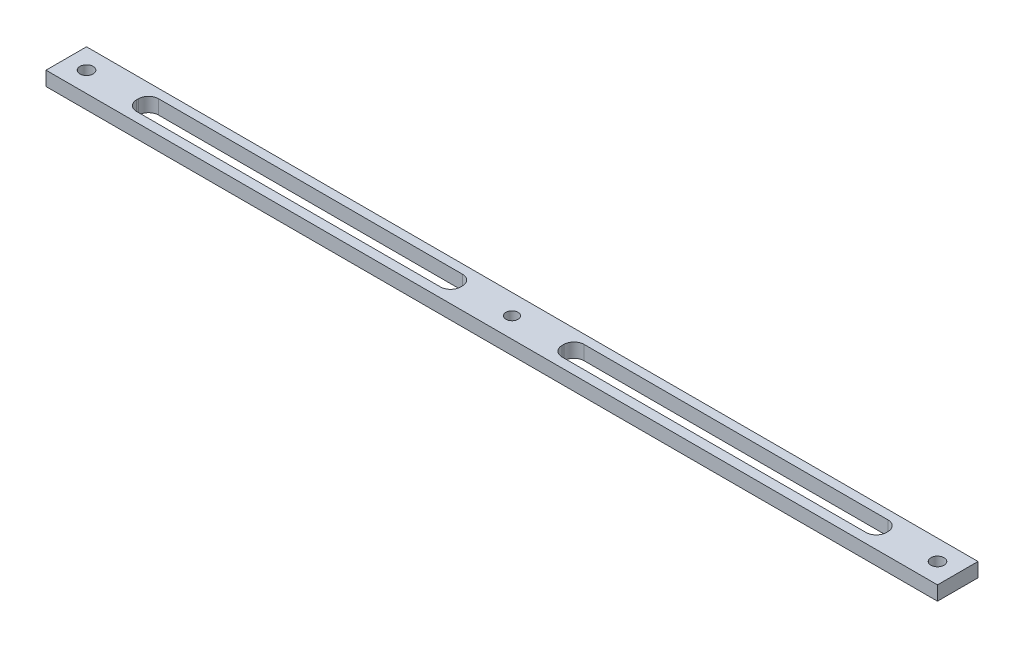
ISO-10303-21;
HEADER;
FILE_DESCRIPTION(('STEP AP214'),'2;1');
FILE_NAME('part.step','',(''),(''),'','','');
FILE_SCHEMA(('AUTOMOTIVE_DESIGN { 1 0 10303 214 1 1 1 1 }'));
ENDSEC;
DATA;
#1=APPLICATION_CONTEXT('core data for automotive mechanical design processes');
#2=APPLICATION_PROTOCOL_DEFINITION('international standard','automotive_design',2000,#1);
#3=PRODUCT_CONTEXT('',#1,'mechanical');
#4=PRODUCT('Part','Part','',(#3));
#5=PRODUCT_RELATED_PRODUCT_CATEGORY('part','',(#4));
#6=PRODUCT_DEFINITION_FORMATION('','',#4);
#7=PRODUCT_DEFINITION_CONTEXT('part definition',#1,'design');
#8=PRODUCT_DEFINITION('design','',#6,#7);
#9=PRODUCT_DEFINITION_SHAPE('','',#8);
#10=(LENGTH_UNIT() NAMED_UNIT(*) SI_UNIT(.MILLI.,.METRE.));
#11=(NAMED_UNIT(*) PLANE_ANGLE_UNIT() SI_UNIT($,.RADIAN.));
#12=(NAMED_UNIT(*) SI_UNIT($,.STERADIAN.) SOLID_ANGLE_UNIT());
#13=UNCERTAINTY_MEASURE_WITH_UNIT(LENGTH_MEASURE(1.E-05),#10,'distance_accuracy_value','');
#14=(GEOMETRIC_REPRESENTATION_CONTEXT(3) GLOBAL_UNCERTAINTY_ASSIGNED_CONTEXT((#13)) GLOBAL_UNIT_ASSIGNED_CONTEXT((#10,
#11,#12)) REPRESENTATION_CONTEXT('',''));
#15=CARTESIAN_POINT('',(0.,0.,0.));
#16=DIRECTION('',(0.,0.,1.));
#17=DIRECTION('',(1.,0.,0.));
#18=AXIS2_PLACEMENT_3D('',#15,#16,#17);
#19=CARTESIAN_POINT('',(0.,7.,0.));
#20=DIRECTION('',(0.,0.,-1.));
#21=DIRECTION('',(-1.,0.,0.));
#22=AXIS2_PLACEMENT_3D('',#19,#20,#21);
#23=PLANE('',#22);
#24=DIRECTION('',(1.,0.,0.));
#25=VECTOR('',#24,1.);
#26=CARTESIAN_POINT('',(0.,0.,0.));
#27=LINE('',#26,#25);
#28=CARTESIAN_POINT('',(0.,0.,0.));
#29=VERTEX_POINT('',#28);
#30=CARTESIAN_POINT('',(440.,0.,-1.07552855510562E-13));
#31=VERTEX_POINT('',#30);
#32=EDGE_CURVE('E296',#29,#31,#27,.T.);
#33=ORIENTED_EDGE('',*,*,#32,.T.);
#34=DIRECTION('',(0.,-1.,0.));
#35=VECTOR('',#34,1.);
#36=CARTESIAN_POINT('',(440.,7.,-1.07552855510562E-13));
#37=LINE('',#36,#35);
#38=CARTESIAN_POINT('',(440.,7.,-1.07552855510562E-13));
#39=VERTEX_POINT('',#38);
#40=EDGE_CURVE('E11',#39,#31,#37,.T.);
#41=ORIENTED_EDGE('',*,*,#40,.F.);
#42=DIRECTION('',(1.,0.,0.));
#43=VECTOR('',#42,1.);
#44=CARTESIAN_POINT('',(0.,7.,0.));
#45=LINE('',#44,#43);
#46=CARTESIAN_POINT('',(0.,7.,0.));
#47=VERTEX_POINT('',#46);
#48=EDGE_CURVE('E199',#47,#39,#45,.T.);
#49=ORIENTED_EDGE('',*,*,#48,.F.);
#50=DIRECTION('',(0.,-1.,0.));
#51=VECTOR('',#50,1.);
#52=CARTESIAN_POINT('',(0.,7.,0.));
#53=LINE('',#52,#51);
#54=EDGE_CURVE('E67',#47,#29,#53,.T.);
#55=ORIENTED_EDGE('',*,*,#54,.T.);
#56=EDGE_LOOP('',(#33,#41,#49,#55));
#57=FACE_BOUND('',#56,.T.);
#58=ADVANCED_FACE('F47',(#57),#23,.F.);
#59=CARTESIAN_POINT('',(440.,7.,0.));
#60=DIRECTION('',(-1.,0.,0.));
#61=DIRECTION('',(0.,0.,1.));
#62=AXIS2_PLACEMENT_3D('',#59,#60,#61);
#63=PLANE('',#62);
#64=DIRECTION('',(0.,0.,-1.));
#65=VECTOR('',#64,1.);
#66=CARTESIAN_POINT('',(440.,0.,0.));
#67=LINE('',#66,#65);
#68=CARTESIAN_POINT('',(440.,0.,-20.));
#69=VERTEX_POINT('',#68);
#70=EDGE_CURVE('E206',#31,#69,#67,.T.);
#71=ORIENTED_EDGE('',*,*,#70,.T.);
#72=DIRECTION('',(0.,-1.,0.));
#73=VECTOR('',#72,1.);
#74=CARTESIAN_POINT('',(440.,7.,-20.));
#75=LINE('',#74,#73);
#76=CARTESIAN_POINT('',(440.,7.,-20.));
#77=VERTEX_POINT('',#76);
#78=EDGE_CURVE('E58',#77,#69,#75,.T.);
#79=ORIENTED_EDGE('',*,*,#78,.F.);
#80=DIRECTION('',(0.,0.,-1.));
#81=VECTOR('',#80,1.);
#82=CARTESIAN_POINT('',(440.,7.,0.));
#83=LINE('',#82,#81);
#84=EDGE_CURVE('E193',#39,#77,#83,.T.);
#85=ORIENTED_EDGE('',*,*,#84,.F.);
#86=ORIENTED_EDGE('',*,*,#40,.T.);
#87=EDGE_LOOP('',(#71,#79,#85,#86));
#88=FACE_BOUND('',#87,.T.);
#89=ADVANCED_FACE('F205',(#88),#63,.F.);
#90=CARTESIAN_POINT('',(0.,7.,-20.));
#91=DIRECTION('',(0.,0.,-1.));
#92=DIRECTION('',(-1.,0.,0.));
#93=AXIS2_PLACEMENT_3D('',#90,#91,#92);
#94=PLANE('',#93);
#95=DIRECTION('',(1.,0.,0.));
#96=VECTOR('',#95,1.);
#97=CARTESIAN_POINT('',(0.,0.,-20.));
#98=LINE('',#97,#96);
#99=CARTESIAN_POINT('',(0.,0.,-20.));
#100=VERTEX_POINT('',#99);
#101=EDGE_CURVE('E301',#100,#69,#98,.T.);
#102=ORIENTED_EDGE('',*,*,#101,.F.);
#103=DIRECTION('',(0.,-1.,0.));
#104=VECTOR('',#103,1.);
#105=CARTESIAN_POINT('',(0.,7.,-20.));
#106=LINE('',#105,#104);
#107=CARTESIAN_POINT('',(0.,7.,-20.));
#108=VERTEX_POINT('',#107);
#109=EDGE_CURVE('E129',#108,#100,#106,.T.);
#110=ORIENTED_EDGE('',*,*,#109,.F.);
#111=DIRECTION('',(1.,0.,0.));
#112=VECTOR('',#111,1.);
#113=CARTESIAN_POINT('',(0.,7.,-20.));
#114=LINE('',#113,#112);
#115=EDGE_CURVE('E198',#108,#77,#114,.T.);
#116=ORIENTED_EDGE('',*,*,#115,.T.);
#117=ORIENTED_EDGE('',*,*,#78,.T.);
#118=EDGE_LOOP('',(#102,#110,#116,#117));
#119=FACE_BOUND('',#118,.T.);
#120=ADVANCED_FACE('F211',(#119),#94,.T.);
#121=CARTESIAN_POINT('',(250.,7.,-10.574576279988));
#122=DIRECTION('',(0.,-1.,0.));
#123=DIRECTION('',(0.,0.,-1.));
#124=AXIS2_PLACEMENT_3D('',#121,#122,#123);
#125=CYLINDRICAL_SURFACE('',#124,5.);
#126=CARTESIAN_POINT('',(250.,0.,-10.574576279988));
#127=DIRECTION('',(0.,1.,0.));
#128=DIRECTION('',(0.,0.,1.));
#129=AXIS2_PLACEMENT_3D('',#126,#127,#128);
#130=CIRCLE('',#129,5.);
#131=CARTESIAN_POINT('',(250.,0.,-15.574576279988));
#132=VERTEX_POINT('',#131);
#133=CARTESIAN_POINT('',(245.,0.,-10.574576279988));
#134=VERTEX_POINT('',#133);
#135=EDGE_CURVE('E264',#132,#134,#130,.T.);
#136=ORIENTED_EDGE('',*,*,#135,.F.);
#137=DIRECTION('',(0.,-1.,0.));
#138=VECTOR('',#137,1.);
#139=CARTESIAN_POINT('',(250.,7.,-15.574576279988));
#140=LINE('',#139,#138);
#141=CARTESIAN_POINT('',(250.,7.,-15.574576279988));
#142=VERTEX_POINT('',#141);
#143=EDGE_CURVE('E311',#142,#132,#140,.T.);
#144=ORIENTED_EDGE('',*,*,#143,.F.);
#145=CARTESIAN_POINT('',(250.,7.,-10.574576279988));
#146=DIRECTION('',(0.,1.,0.));
#147=DIRECTION('',(0.,0.,1.));
#148=AXIS2_PLACEMENT_3D('',#145,#146,#147);
#149=CIRCLE('',#148,5.);
#150=CARTESIAN_POINT('',(245.,7.,-10.574576279988));
#151=VERTEX_POINT('',#150);
#152=EDGE_CURVE('E421',#142,#151,#149,.T.);
#153=ORIENTED_EDGE('',*,*,#152,.T.);
#154=DIRECTION('',(0.,-1.,0.));
#155=VECTOR('',#154,1.);
#156=CARTESIAN_POINT('',(245.,7.,-10.574576279988));
#157=LINE('',#156,#155);
#158=EDGE_CURVE('E314',#151,#134,#157,.T.);
#159=ORIENTED_EDGE('',*,*,#158,.T.);
#160=EDGE_LOOP('',(#136,#144,#153,#159));
#161=FACE_BOUND('',#160,.T.);
#162=ADVANCED_FACE('F467',(#161),#125,.F.);
#163=CARTESIAN_POINT('',(0.,7.,-15.574576279988));
#164=DIRECTION('',(0.,0.,-1.));
#165=DIRECTION('',(-1.,0.,0.));
#166=AXIS2_PLACEMENT_3D('',#163,#164,#165);
#167=PLANE('',#166);
#168=DIRECTION('',(1.,0.,0.));
#169=VECTOR('',#168,1.);
#170=CARTESIAN_POINT('',(0.,0.,-15.574576279988));
#171=LINE('',#170,#169);
#172=CARTESIAN_POINT('',(400.,0.,-15.574576279988));
#173=VERTEX_POINT('',#172);
#174=EDGE_CURVE('E268',#132,#173,#171,.T.);
#175=ORIENTED_EDGE('',*,*,#174,.T.);
#176=DIRECTION('',(0.,-1.,0.));
#177=VECTOR('',#176,1.);
#178=CARTESIAN_POINT('',(400.,7.,-15.574576279988));
#179=LINE('',#178,#177);
#180=CARTESIAN_POINT('',(400.,7.,-15.574576279988));
#181=VERTEX_POINT('',#180);
#182=EDGE_CURVE('E332',#181,#173,#179,.T.);
#183=ORIENTED_EDGE('',*,*,#182,.F.);
#184=DIRECTION('',(1.,0.,0.));
#185=VECTOR('',#184,1.);
#186=CARTESIAN_POINT('',(0.,7.,-15.574576279988));
#187=LINE('',#186,#185);
#188=EDGE_CURVE('E425',#142,#181,#187,.T.);
#189=ORIENTED_EDGE('',*,*,#188,.F.);
#190=ORIENTED_EDGE('',*,*,#143,.T.);
#191=EDGE_LOOP('',(#175,#183,#189,#190));
#192=FACE_BOUND('',#191,.T.);
#193=ADVANCED_FACE('F471',(#192),#167,.F.);
#194=CARTESIAN_POINT('',(400.,7.,-10.574576279988));
#195=DIRECTION('',(0.,-1.,0.));
#196=DIRECTION('',(0.,0.,-1.));
#197=AXIS2_PLACEMENT_3D('',#194,#195,#196);
#198=CYLINDRICAL_SURFACE('',#197,5.);
#199=CARTESIAN_POINT('',(400.,0.,-10.574576279988));
#200=DIRECTION('',(0.,1.,0.));
#201=DIRECTION('',(0.,0.,1.));
#202=AXIS2_PLACEMENT_3D('',#199,#200,#201);
#203=CIRCLE('',#202,5.);
#204=CARTESIAN_POINT('',(405.,0.,-10.574576279988));
#205=VERTEX_POINT('',#204);
#206=EDGE_CURVE('E272',#205,#173,#203,.T.);
#207=ORIENTED_EDGE('',*,*,#206,.F.);
#208=DIRECTION('',(0.,-1.,0.));
#209=VECTOR('',#208,1.);
#210=CARTESIAN_POINT('',(405.,7.,-10.574576279988));
#211=LINE('',#210,#209);
#212=CARTESIAN_POINT('',(405.,7.,-10.574576279988));
#213=VERTEX_POINT('',#212);
#214=EDGE_CURVE('E329',#213,#205,#211,.T.);
#215=ORIENTED_EDGE('',*,*,#214,.F.);
#216=CARTESIAN_POINT('',(400.,7.,-10.574576279988));
#217=DIRECTION('',(0.,1.,0.));
#218=DIRECTION('',(0.,0.,1.));
#219=AXIS2_PLACEMENT_3D('',#216,#217,#218);
#220=CIRCLE('',#219,5.);
#221=EDGE_CURVE('E428',#213,#181,#220,.T.);
#222=ORIENTED_EDGE('',*,*,#221,.T.);
#223=ORIENTED_EDGE('',*,*,#182,.T.);
#224=EDGE_LOOP('',(#207,#215,#222,#223));
#225=FACE_BOUND('',#224,.T.);
#226=ADVANCED_FACE('F477',(#225),#198,.F.);
#227=CARTESIAN_POINT('',(405.,7.,0.));
#228=DIRECTION('',(1.,0.,0.));
#229=DIRECTION('',(0.,0.,-1.));
#230=AXIS2_PLACEMENT_3D('',#227,#228,#229);
#231=PLANE('',#230);
#232=DIRECTION('',(0.,0.,1.));
#233=VECTOR('',#232,1.);
#234=CARTESIAN_POINT('',(405.,0.,0.));
#235=LINE('',#234,#233);
#236=CARTESIAN_POINT('',(405.,0.,-9.75277634577937));
#237=VERTEX_POINT('',#236);
#238=EDGE_CURVE('E276',#205,#237,#235,.T.);
#239=ORIENTED_EDGE('',*,*,#238,.T.);
#240=DIRECTION('',(0.,-1.,0.));
#241=VECTOR('',#240,1.);
#242=CARTESIAN_POINT('',(405.,7.,-9.75277634577937));
#243=LINE('',#242,#241);
#244=CARTESIAN_POINT('',(405.,7.,-9.75277634577937));
#245=VERTEX_POINT('',#244);
#246=EDGE_CURVE('E326',#245,#237,#243,.T.);
#247=ORIENTED_EDGE('',*,*,#246,.F.);
#248=DIRECTION('',(0.,0.,1.));
#249=VECTOR('',#248,1.);
#250=CARTESIAN_POINT('',(405.,7.,0.));
#251=LINE('',#250,#249);
#252=EDGE_CURVE('E432',#213,#245,#251,.T.);
#253=ORIENTED_EDGE('',*,*,#252,.F.);
#254=ORIENTED_EDGE('',*,*,#214,.T.);
#255=EDGE_LOOP('',(#239,#247,#253,#254));
#256=FACE_BOUND('',#255,.T.);
#257=ADVANCED_FACE('F480',(#256),#231,.F.);
#258=CARTESIAN_POINT('',(400.,7.,-9.75277634577937));
#259=DIRECTION('',(0.,-1.,0.));
#260=DIRECTION('',(0.,0.,-1.));
#261=AXIS2_PLACEMENT_3D('',#258,#259,#260);
#262=CYLINDRICAL_SURFACE('',#261,5.);
#263=CARTESIAN_POINT('',(400.,0.,-9.75277634577937));
#264=DIRECTION('',(0.,1.,0.));
#265=DIRECTION('',(0.,0.,1.));
#266=AXIS2_PLACEMENT_3D('',#263,#264,#265);
#267=CIRCLE('',#266,5.);
#268=CARTESIAN_POINT('',(400.,0.,-4.75277634577937));
#269=VERTEX_POINT('',#268);
#270=EDGE_CURVE('E280',#269,#237,#267,.T.);
#271=ORIENTED_EDGE('',*,*,#270,.F.);
#272=DIRECTION('',(0.,-1.,0.));
#273=VECTOR('',#272,1.);
#274=CARTESIAN_POINT('',(400.,7.,-4.75277634577937));
#275=LINE('',#274,#273);
#276=CARTESIAN_POINT('',(400.,7.,-4.75277634577937));
#277=VERTEX_POINT('',#276);
#278=EDGE_CURVE('E323',#277,#269,#275,.T.);
#279=ORIENTED_EDGE('',*,*,#278,.F.);
#280=CARTESIAN_POINT('',(400.,7.,-9.75277634577937));
#281=DIRECTION('',(0.,1.,0.));
#282=DIRECTION('',(0.,0.,1.));
#283=AXIS2_PLACEMENT_3D('',#280,#281,#282);
#284=CIRCLE('',#283,5.);
#285=EDGE_CURVE('E435',#277,#245,#284,.T.);
#286=ORIENTED_EDGE('',*,*,#285,.T.);
#287=ORIENTED_EDGE('',*,*,#246,.T.);
#288=EDGE_LOOP('',(#271,#279,#286,#287));
#289=FACE_BOUND('',#288,.T.);
#290=ADVANCED_FACE('F483',(#289),#262,.F.);
#291=CARTESIAN_POINT('',(0.,7.,-4.75277634577937));
#292=DIRECTION('',(0.,0.,-1.));
#293=DIRECTION('',(-1.,0.,0.));
#294=AXIS2_PLACEMENT_3D('',#291,#292,#293);
#295=PLANE('',#294);
#296=DIRECTION('',(1.,0.,0.));
#297=VECTOR('',#296,1.);
#298=CARTESIAN_POINT('',(0.,0.,-4.75277634577937));
#299=LINE('',#298,#297);
#300=CARTESIAN_POINT('',(250.,0.,-4.75277634577937));
#301=VERTEX_POINT('',#300);
#302=EDGE_CURVE('E284',#301,#269,#299,.T.);
#303=ORIENTED_EDGE('',*,*,#302,.F.);
#304=DIRECTION('',(0.,-1.,0.));
#305=VECTOR('',#304,1.);
#306=CARTESIAN_POINT('',(250.,7.,-4.75277634577937));
#307=LINE('',#306,#305);
#308=CARTESIAN_POINT('',(250.,7.,-4.75277634577937));
#309=VERTEX_POINT('',#308);
#310=EDGE_CURVE('E320',#309,#301,#307,.T.);
#311=ORIENTED_EDGE('',*,*,#310,.F.);
#312=DIRECTION('',(1.,0.,0.));
#313=VECTOR('',#312,1.);
#314=CARTESIAN_POINT('',(0.,7.,-4.75277634577937));
#315=LINE('',#314,#313);
#316=EDGE_CURVE('E439',#309,#277,#315,.T.);
#317=ORIENTED_EDGE('',*,*,#316,.T.);
#318=ORIENTED_EDGE('',*,*,#278,.T.);
#319=EDGE_LOOP('',(#303,#311,#317,#318));
#320=FACE_BOUND('',#319,.T.);
#321=ADVANCED_FACE('F485',(#320),#295,.T.);
#322=CARTESIAN_POINT('',(250.,7.,-9.75277634577937));
#323=DIRECTION('',(0.,-1.,0.));
#324=DIRECTION('',(0.,0.,-1.));
#325=AXIS2_PLACEMENT_3D('',#322,#323,#324);
#326=CYLINDRICAL_SURFACE('',#325,5.);
#327=CARTESIAN_POINT('',(250.,0.,-9.75277634577937));
#328=DIRECTION('',(0.,1.,0.));
#329=DIRECTION('',(0.,0.,1.));
#330=AXIS2_PLACEMENT_3D('',#327,#328,#329);
#331=CIRCLE('',#330,5.);
#332=CARTESIAN_POINT('',(245.,0.,-9.75277634577937));
#333=VERTEX_POINT('',#332);
#334=EDGE_CURVE('E288',#301,#333,#331,.F.);
#335=ORIENTED_EDGE('',*,*,#334,.T.);
#336=DIRECTION('',(0.,-1.,0.));
#337=VECTOR('',#336,1.);
#338=CARTESIAN_POINT('',(245.,7.,-9.75277634577937));
#339=LINE('',#338,#337);
#340=CARTESIAN_POINT('',(245.,7.,-9.75277634577937));
#341=VERTEX_POINT('',#340);
#342=EDGE_CURVE('E317',#341,#333,#339,.T.);
#343=ORIENTED_EDGE('',*,*,#342,.F.);
#344=CARTESIAN_POINT('',(250.,7.,-9.75277634577937));
#345=DIRECTION('',(0.,1.,0.));
#346=DIRECTION('',(0.,0.,1.));
#347=AXIS2_PLACEMENT_3D('',#344,#345,#346);
#348=CIRCLE('',#347,5.);
#349=EDGE_CURVE('E443',#309,#341,#348,.F.);
#350=ORIENTED_EDGE('',*,*,#349,.F.);
#351=ORIENTED_EDGE('',*,*,#310,.T.);
#352=EDGE_LOOP('',(#335,#343,#350,#351));
#353=FACE_BOUND('',#352,.T.);
#354=ADVANCED_FACE('F460',(#353),#326,.F.);
#355=CARTESIAN_POINT('',(40.,7.,-10.5745762799879));
#356=DIRECTION('',(0.,-1.,0.));
#357=DIRECTION('',(0.,0.,-1.));
#358=AXIS2_PLACEMENT_3D('',#355,#356,#357);
#359=CYLINDRICAL_SURFACE('',#358,4.99999999999999);
#360=CARTESIAN_POINT('',(40.,0.,-10.5745762799879));
#361=DIRECTION('',(0.,1.,0.));
#362=DIRECTION('',(0.,0.,1.));
#363=AXIS2_PLACEMENT_3D('',#360,#361,#362);
#364=CIRCLE('',#363,4.99999999999999);
#365=CARTESIAN_POINT('',(40.,0.,-15.5745762799879));
#366=VERTEX_POINT('',#365);
#367=CARTESIAN_POINT('',(35.,0.,-10.5745762799879));
#368=VERTEX_POINT('',#367);
#369=EDGE_CURVE('E232',#366,#368,#364,.T.);
#370=ORIENTED_EDGE('',*,*,#369,.F.);
#371=DIRECTION('',(0.,-1.,0.));
#372=VECTOR('',#371,1.);
#373=CARTESIAN_POINT('',(40.,7.,-15.5745762799879));
#374=LINE('',#373,#372);
#375=CARTESIAN_POINT('',(40.,7.,-15.5745762799879));
#376=VERTEX_POINT('',#375);
#377=EDGE_CURVE('E51',#376,#366,#374,.T.);
#378=ORIENTED_EDGE('',*,*,#377,.F.);
#379=CARTESIAN_POINT('',(40.,7.,-10.5745762799879));
#380=DIRECTION('',(0.,1.,0.));
#381=DIRECTION('',(0.,0.,1.));
#382=AXIS2_PLACEMENT_3D('',#379,#380,#381);
#383=CIRCLE('',#382,4.99999999999999);
#384=CARTESIAN_POINT('',(35.,7.,-10.5745762799879));
#385=VERTEX_POINT('',#384);
#386=EDGE_CURVE('E371',#376,#385,#383,.T.);
#387=ORIENTED_EDGE('',*,*,#386,.T.);
#388=DIRECTION('',(0.,-1.,0.));
#389=VECTOR('',#388,1.);
#390=CARTESIAN_POINT('',(35.,7.,-10.5745762799879));
#391=LINE('',#390,#389);
#392=EDGE_CURVE('E216',#385,#368,#391,.T.);
#393=ORIENTED_EDGE('',*,*,#392,.T.);
#394=EDGE_LOOP('',(#370,#378,#387,#393));
#395=FACE_BOUND('',#394,.T.);
#396=ADVANCED_FACE('F370',(#395),#359,.F.);
#397=CARTESIAN_POINT('',(0.,7.,-15.5745762799879));
#398=DIRECTION('',(0.,0.,-1.));
#399=DIRECTION('',(-1.,0.,0.));
#400=AXIS2_PLACEMENT_3D('',#397,#398,#399);
#401=PLANE('',#400);
#402=DIRECTION('',(1.,0.,0.));
#403=VECTOR('',#402,1.);
#404=CARTESIAN_POINT('',(0.,0.,-15.5745762799879));
#405=LINE('',#404,#403);
#406=CARTESIAN_POINT('',(190.,0.,-15.5745762799879));
#407=VERTEX_POINT('',#406);
#408=EDGE_CURVE('E236',#366,#407,#405,.T.);
#409=ORIENTED_EDGE('',*,*,#408,.T.);
#410=DIRECTION('',(0.,-1.,0.));
#411=VECTOR('',#410,1.);
#412=CARTESIAN_POINT('',(190.,7.,-15.5745762799879));
#413=LINE('',#412,#411);
#414=CARTESIAN_POINT('',(190.,7.,-15.5745762799879));
#415=VERTEX_POINT('',#414);
#416=EDGE_CURVE('E353',#415,#407,#413,.T.);
#417=ORIENTED_EDGE('',*,*,#416,.F.);
#418=DIRECTION('',(1.,0.,0.));
#419=VECTOR('',#418,1.);
#420=CARTESIAN_POINT('',(0.,7.,-15.5745762799879));
#421=LINE('',#420,#419);
#422=EDGE_CURVE('E363',#376,#415,#421,.T.);
#423=ORIENTED_EDGE('',*,*,#422,.F.);
#424=ORIENTED_EDGE('',*,*,#377,.T.);
#425=EDGE_LOOP('',(#409,#417,#423,#424));
#426=FACE_BOUND('',#425,.T.);
#427=ADVANCED_FACE('F362',(#426),#401,.F.);
#428=CARTESIAN_POINT('',(190.,7.,-10.5745762799879));
#429=DIRECTION('',(0.,-1.,0.));
#430=DIRECTION('',(0.,0.,-1.));
#431=AXIS2_PLACEMENT_3D('',#428,#429,#430);
#432=CYLINDRICAL_SURFACE('',#431,5.);
#433=CARTESIAN_POINT('',(190.,0.,-10.5745762799879));
#434=DIRECTION('',(0.,1.,0.));
#435=DIRECTION('',(0.,0.,1.));
#436=AXIS2_PLACEMENT_3D('',#433,#434,#435);
#437=CIRCLE('',#436,5.);
#438=CARTESIAN_POINT('',(195.,0.,-10.5745762799879));
#439=VERTEX_POINT('',#438);
#440=EDGE_CURVE('E240',#439,#407,#437,.T.);
#441=ORIENTED_EDGE('',*,*,#440,.F.);
#442=DIRECTION('',(0.,-1.,0.));
#443=VECTOR('',#442,1.);
#444=CARTESIAN_POINT('',(195.,7.,-10.5745762799879));
#445=LINE('',#444,#443);
#446=CARTESIAN_POINT('',(195.,7.,-10.5745762799879));
#447=VERTEX_POINT('',#446);
#448=EDGE_CURVE('E351',#447,#439,#445,.T.);
#449=ORIENTED_EDGE('',*,*,#448,.F.);
#450=CARTESIAN_POINT('',(190.,7.,-10.5745762799879));
#451=DIRECTION('',(0.,1.,0.));
#452=DIRECTION('',(0.,0.,1.));
#453=AXIS2_PLACEMENT_3D('',#450,#451,#452);
#454=CIRCLE('',#453,5.);
#455=EDGE_CURVE('E399',#447,#415,#454,.T.);
#456=ORIENTED_EDGE('',*,*,#455,.T.);
#457=ORIENTED_EDGE('',*,*,#416,.T.);
#458=EDGE_LOOP('',(#441,#449,#456,#457));
#459=FACE_BOUND('',#458,.T.);
#460=ADVANCED_FACE('F396',(#459),#432,.F.);
#461=CARTESIAN_POINT('',(195.,7.,0.));
#462=DIRECTION('',(1.,0.,0.));
#463=DIRECTION('',(0.,0.,-1.));
#464=AXIS2_PLACEMENT_3D('',#461,#462,#463);
#465=PLANE('',#464);
#466=DIRECTION('',(0.,0.,1.));
#467=VECTOR('',#466,1.);
#468=CARTESIAN_POINT('',(195.,0.,0.));
#469=LINE('',#468,#467);
#470=CARTESIAN_POINT('',(195.,0.,-9.69671937911455));
#471=VERTEX_POINT('',#470);
#472=EDGE_CURVE('E244',#439,#471,#469,.T.);
#473=ORIENTED_EDGE('',*,*,#472,.T.);
#474=DIRECTION('',(0.,-1.,0.));
#475=VECTOR('',#474,1.);
#476=CARTESIAN_POINT('',(195.,7.,-9.69671937911455));
#477=LINE('',#476,#475);
#478=CARTESIAN_POINT('',(195.,7.,-9.69671937911455));
#479=VERTEX_POINT('',#478);
#480=EDGE_CURVE('E348',#479,#471,#477,.T.);
#481=ORIENTED_EDGE('',*,*,#480,.F.);
#482=DIRECTION('',(0.,0.,1.));
#483=VECTOR('',#482,1.);
#484=CARTESIAN_POINT('',(195.,7.,0.));
#485=LINE('',#484,#483);
#486=EDGE_CURVE('E400',#447,#479,#485,.T.);
#487=ORIENTED_EDGE('',*,*,#486,.F.);
#488=ORIENTED_EDGE('',*,*,#448,.T.);
#489=EDGE_LOOP('',(#473,#481,#487,#488));
#490=FACE_BOUND('',#489,.T.);
#491=ADVANCED_FACE('F401',(#490),#465,.F.);
#492=CARTESIAN_POINT('',(190.,7.,-9.69671937911455));
#493=DIRECTION('',(0.,-1.,0.));
#494=DIRECTION('',(0.,0.,-1.));
#495=AXIS2_PLACEMENT_3D('',#492,#493,#494);
#496=CYLINDRICAL_SURFACE('',#495,5.);
#497=CARTESIAN_POINT('',(190.,0.,-9.69671937911455));
#498=DIRECTION('',(0.,1.,0.));
#499=DIRECTION('',(0.,0.,1.));
#500=AXIS2_PLACEMENT_3D('',#497,#498,#499);
#501=CIRCLE('',#500,5.);
#502=CARTESIAN_POINT('',(190.,0.,-4.69671937911455));
#503=VERTEX_POINT('',#502);
#504=EDGE_CURVE('E248',#503,#471,#501,.T.);
#505=ORIENTED_EDGE('',*,*,#504,.F.);
#506=DIRECTION('',(0.,-1.,0.));
#507=VECTOR('',#506,1.);
#508=CARTESIAN_POINT('',(190.,7.,-4.69671937911455));
#509=LINE('',#508,#507);
#510=CARTESIAN_POINT('',(190.,7.,-4.69671937911455));
#511=VERTEX_POINT('',#510);
#512=EDGE_CURVE('E345',#511,#503,#509,.T.);
#513=ORIENTED_EDGE('',*,*,#512,.F.);
#514=CARTESIAN_POINT('',(190.,7.,-9.69671937911455));
#515=DIRECTION('',(0.,1.,0.));
#516=DIRECTION('',(0.,0.,1.));
#517=AXIS2_PLACEMENT_3D('',#514,#515,#516);
#518=CIRCLE('',#517,5.);
#519=EDGE_CURVE('E404',#511,#479,#518,.T.);
#520=ORIENTED_EDGE('',*,*,#519,.T.);
#521=ORIENTED_EDGE('',*,*,#480,.T.);
#522=EDGE_LOOP('',(#505,#513,#520,#521));
#523=FACE_BOUND('',#522,.T.);
#524=ADVANCED_FACE('F393',(#523),#496,.F.);
#525=CARTESIAN_POINT('',(0.,7.,-4.69671937911455));
#526=DIRECTION('',(0.,0.,-1.));
#527=DIRECTION('',(-1.,0.,0.));
#528=AXIS2_PLACEMENT_3D('',#525,#526,#527);
#529=PLANE('',#528);
#530=DIRECTION('',(1.,0.,0.));
#531=VECTOR('',#530,1.);
#532=CARTESIAN_POINT('',(0.,0.,-4.69671937911455));
#533=LINE('',#532,#531);
#534=CARTESIAN_POINT('',(40.,0.,-4.69671937911455));
#535=VERTEX_POINT('',#534);
#536=EDGE_CURVE('E252',#535,#503,#533,.T.);
#537=ORIENTED_EDGE('',*,*,#536,.F.);
#538=DIRECTION('',(0.,-1.,0.));
#539=VECTOR('',#538,1.);
#540=CARTESIAN_POINT('',(40.,7.,-4.69671937911455));
#541=LINE('',#540,#539);
#542=CARTESIAN_POINT('',(40.,7.,-4.69671937911455));
#543=VERTEX_POINT('',#542);
#544=EDGE_CURVE('E342',#543,#535,#541,.T.);
#545=ORIENTED_EDGE('',*,*,#544,.F.);
#546=DIRECTION('',(1.,0.,0.));
#547=VECTOR('',#546,1.);
#548=CARTESIAN_POINT('',(0.,7.,-4.69671937911455));
#549=LINE('',#548,#547);
#550=EDGE_CURVE('E389',#543,#511,#549,.T.);
#551=ORIENTED_EDGE('',*,*,#550,.T.);
#552=ORIENTED_EDGE('',*,*,#512,.T.);
#553=EDGE_LOOP('',(#537,#545,#551,#552));
#554=FACE_BOUND('',#553,.T.);
#555=ADVANCED_FACE('F387',(#554),#529,.T.);
#556=CARTESIAN_POINT('',(40.,7.,-9.69671937911455));
#557=DIRECTION('',(0.,-1.,0.));
#558=DIRECTION('',(0.,0.,-1.));
#559=AXIS2_PLACEMENT_3D('',#556,#557,#558);
#560=CYLINDRICAL_SURFACE('',#559,5.);
#561=CARTESIAN_POINT('',(40.,0.,-9.69671937911455));
#562=DIRECTION('',(0.,1.,0.));
#563=DIRECTION('',(0.,0.,1.));
#564=AXIS2_PLACEMENT_3D('',#561,#562,#563);
#565=CIRCLE('',#564,5.);
#566=CARTESIAN_POINT('',(35.,0.,-9.69671937911455));
#567=VERTEX_POINT('',#566);
#568=EDGE_CURVE('E256',#567,#535,#565,.T.);
#569=ORIENTED_EDGE('',*,*,#568,.F.);
#570=DIRECTION('',(0.,-1.,0.));
#571=VECTOR('',#570,1.);
#572=CARTESIAN_POINT('',(35.,7.,-9.69671937911455));
#573=LINE('',#572,#571);
#574=CARTESIAN_POINT('',(35.,7.,-9.69671937911455));
#575=VERTEX_POINT('',#574);
#576=EDGE_CURVE('E339',#575,#567,#573,.T.);
#577=ORIENTED_EDGE('',*,*,#576,.F.);
#578=CARTESIAN_POINT('',(40.,7.,-9.69671937911455));
#579=DIRECTION('',(0.,1.,0.));
#580=DIRECTION('',(0.,0.,1.));
#581=AXIS2_PLACEMENT_3D('',#578,#579,#580);
#582=CIRCLE('',#581,5.);
#583=EDGE_CURVE('E383',#575,#543,#582,.T.);
#584=ORIENTED_EDGE('',*,*,#583,.T.);
#585=ORIENTED_EDGE('',*,*,#544,.T.);
#586=EDGE_LOOP('',(#569,#577,#584,#585));
#587=FACE_BOUND('',#586,.T.);
#588=ADVANCED_FACE('F380',(#587),#560,.F.);
#589=CARTESIAN_POINT('',(245.,7.,0.));
#590=DIRECTION('',(1.,0.,0.));
#591=DIRECTION('',(0.,0.,-1.));
#592=AXIS2_PLACEMENT_3D('',#589,#590,#591);
#593=PLANE('',#592);
#594=DIRECTION('',(0.,0.,1.));
#595=VECTOR('',#594,1.);
#596=CARTESIAN_POINT('',(245.,0.,0.));
#597=LINE('',#596,#595);
#598=EDGE_CURVE('E292',#134,#333,#597,.T.);
#599=ORIENTED_EDGE('',*,*,#598,.F.);
#600=ORIENTED_EDGE('',*,*,#158,.F.);
#601=DIRECTION('',(0.,0.,1.));
#602=VECTOR('',#601,1.);
#603=CARTESIAN_POINT('',(245.,7.,0.));
#604=LINE('',#603,#602);
#605=EDGE_CURVE('E446',#151,#341,#604,.T.);
#606=ORIENTED_EDGE('',*,*,#605,.T.);
#607=ORIENTED_EDGE('',*,*,#342,.T.);
#608=EDGE_LOOP('',(#599,#600,#606,#607));
#609=FACE_BOUND('',#608,.T.);
#610=ADVANCED_FACE('F453',(#609),#593,.T.);
#611=CARTESIAN_POINT('',(35.,7.,0.));
#612=DIRECTION('',(1.,0.,0.));
#613=DIRECTION('',(0.,0.,-1.));
#614=AXIS2_PLACEMENT_3D('',#611,#612,#613);
#615=PLANE('',#614);
#616=DIRECTION('',(0.,0.,1.));
#617=VECTOR('',#616,1.);
#618=CARTESIAN_POINT('',(35.,0.,0.));
#619=LINE('',#618,#617);
#620=EDGE_CURVE('E260',#368,#567,#619,.T.);
#621=ORIENTED_EDGE('',*,*,#620,.F.);
#622=ORIENTED_EDGE('',*,*,#392,.F.);
#623=DIRECTION('',(0.,0.,1.));
#624=VECTOR('',#623,1.);
#625=CARTESIAN_POINT('',(35.,7.,0.));
#626=LINE('',#625,#624);
#627=EDGE_CURVE('E376',#385,#575,#626,.T.);
#628=ORIENTED_EDGE('',*,*,#627,.T.);
#629=ORIENTED_EDGE('',*,*,#576,.T.);
#630=EDGE_LOOP('',(#621,#622,#628,#629));
#631=FACE_BOUND('',#630,.T.);
#632=ADVANCED_FACE('F375',(#631),#615,.T.);
#633=CARTESIAN_POINT('',(220.,7.,-10.));
#634=DIRECTION('',(0.,-1.,0.));
#635=DIRECTION('',(0.,0.,-1.));
#636=AXIS2_PLACEMENT_3D('',#633,#634,#635);
#637=CYLINDRICAL_SURFACE('',#636,2.99999999999999);
#638=CARTESIAN_POINT('',(220.,7.,-10.));
#639=DIRECTION('',(0.,1.,0.));
#640=DIRECTION('',(0.,0.,1.));
#641=AXIS2_PLACEMENT_3D('',#638,#639,#640);
#642=CIRCLE('',#641,2.99999999999999);
#643=CARTESIAN_POINT('',(220.,7.,-7.00000000000001));
#644=VERTEX_POINT('',#643);
#645=EDGE_CURVE('E709',#644,#644,#642,.T.);
#646=ORIENTED_EDGE('',*,*,#645,.T.);
#647=EDGE_LOOP('',(#646));
#648=FACE_BOUND('',#647,.T.);
#649=CARTESIAN_POINT('',(220.,0.,-10.));
#650=DIRECTION('',(0.,1.,0.));
#651=DIRECTION('',(0.,0.,1.));
#652=AXIS2_PLACEMENT_3D('',#649,#650,#651);
#653=CIRCLE('',#652,2.99999999999999);
#654=CARTESIAN_POINT('',(220.,0.,-7.00000000000001));
#655=VERTEX_POINT('',#654);
#656=EDGE_CURVE('E228',#655,#655,#653,.T.);
#657=ORIENTED_EDGE('',*,*,#656,.F.);
#658=EDGE_LOOP('',(#657));
#659=FACE_BOUND('',#658,.T.);
#660=ADVANCED_FACE('F507',(#648,#659),#637,.F.);
#661=CARTESIAN_POINT('',(10.,7.,-10.));
#662=DIRECTION('',(0.,-1.,0.));
#663=DIRECTION('',(0.,0.,-1.));
#664=AXIS2_PLACEMENT_3D('',#661,#662,#663);
#665=CYLINDRICAL_SURFACE('',#664,3.25);
#666=CARTESIAN_POINT('',(10.,7.,-10.));
#667=DIRECTION('',(0.,1.,0.));
#668=DIRECTION('',(0.,0.,1.));
#669=AXIS2_PLACEMENT_3D('',#666,#667,#668);
#670=CIRCLE('',#669,3.25);
#671=CARTESIAN_POINT('',(10.,7.,-6.75));
#672=VERTEX_POINT('',#671);
#673=EDGE_CURVE('E539',#672,#672,#670,.T.);
#674=ORIENTED_EDGE('',*,*,#673,.T.);
#675=EDGE_LOOP('',(#674));
#676=FACE_BOUND('',#675,.T.);
#677=CARTESIAN_POINT('',(10.,0.,-10.));
#678=DIRECTION('',(0.,1.,0.));
#679=DIRECTION('',(0.,0.,1.));
#680=AXIS2_PLACEMENT_3D('',#677,#678,#679);
#681=CIRCLE('',#680,3.25);
#682=CARTESIAN_POINT('',(10.,0.,-6.75));
#683=VERTEX_POINT('',#682);
#684=EDGE_CURVE('E224',#683,#683,#681,.T.);
#685=ORIENTED_EDGE('',*,*,#684,.F.);
#686=EDGE_LOOP('',(#685));
#687=FACE_BOUND('',#686,.T.);
#688=ADVANCED_FACE('F527',(#676,#687),#665,.F.);
#689=CARTESIAN_POINT('',(430.,7.,-10.));
#690=DIRECTION('',(0.,-1.,0.));
#691=DIRECTION('',(0.,0.,-1.));
#692=AXIS2_PLACEMENT_3D('',#689,#690,#691);
#693=CYLINDRICAL_SURFACE('',#692,3.25000000000001);
#694=CARTESIAN_POINT('',(430.,7.,-10.));
#695=DIRECTION('',(0.,1.,0.));
#696=DIRECTION('',(0.,0.,1.));
#697=AXIS2_PLACEMENT_3D('',#694,#695,#696);
#698=CIRCLE('',#697,3.25000000000001);
#699=CARTESIAN_POINT('',(430.,7.,-6.75000000000002));
#700=VERTEX_POINT('',#699);
#701=EDGE_CURVE('E308',#700,#700,#698,.T.);
#702=ORIENTED_EDGE('',*,*,#701,.T.);
#703=EDGE_LOOP('',(#702));
#704=FACE_BOUND('',#703,.T.);
#705=CARTESIAN_POINT('',(430.,0.,-10.));
#706=DIRECTION('',(0.,1.,0.));
#707=DIRECTION('',(0.,0.,1.));
#708=AXIS2_PLACEMENT_3D('',#705,#706,#707);
#709=CIRCLE('',#708,3.25000000000001);
#710=CARTESIAN_POINT('',(430.,0.,-6.75000000000002));
#711=VERTEX_POINT('',#710);
#712=EDGE_CURVE('E220',#711,#711,#709,.T.);
#713=ORIENTED_EDGE('',*,*,#712,.F.);
#714=EDGE_LOOP('',(#713));
#715=FACE_BOUND('',#714,.T.);
#716=ADVANCED_FACE('F49',(#704,#715),#693,.F.);
#717=CARTESIAN_POINT('',(0.,7.,0.));
#718=DIRECTION('',(-1.,0.,0.));
#719=DIRECTION('',(0.,0.,1.));
#720=AXIS2_PLACEMENT_3D('',#717,#718,#719);
#721=PLANE('',#720);
#722=DIRECTION('',(0.,0.,-1.));
#723=VECTOR('',#722,1.);
#724=CARTESIAN_POINT('',(0.,0.,0.));
#725=LINE('',#724,#723);
#726=EDGE_CURVE('E304',#29,#100,#725,.T.);
#727=ORIENTED_EDGE('',*,*,#726,.F.);
#728=ORIENTED_EDGE('',*,*,#54,.F.);
#729=DIRECTION('',(0.,0.,-1.));
#730=VECTOR('',#729,1.);
#731=CARTESIAN_POINT('',(0.,7.,0.));
#732=LINE('',#731,#730);
#733=EDGE_CURVE('E213',#47,#108,#732,.T.);
#734=ORIENTED_EDGE('',*,*,#733,.T.);
#735=ORIENTED_EDGE('',*,*,#109,.T.);
#736=EDGE_LOOP('',(#727,#728,#734,#735));
#737=FACE_BOUND('',#736,.T.);
#738=ADVANCED_FACE('F534',(#737),#721,.T.);
#739=CARTESIAN_POINT('',(0.,7.,0.));
#740=DIRECTION('',(0.,1.,0.));
#741=DIRECTION('',(0.,0.,1.));
#742=AXIS2_PLACEMENT_3D('',#739,#740,#741);
#743=PLANE('',#742);
#744=ORIENTED_EDGE('',*,*,#701,.F.);
#745=EDGE_LOOP('',(#744));
#746=FACE_BOUND('',#745,.T.);
#747=ORIENTED_EDGE('',*,*,#673,.F.);
#748=EDGE_LOOP('',(#747));
#749=FACE_BOUND('',#748,.T.);
#750=ORIENTED_EDGE('',*,*,#645,.F.);
#751=EDGE_LOOP('',(#750));
#752=FACE_BOUND('',#751,.T.);
#753=ORIENTED_EDGE('',*,*,#386,.F.);
#754=ORIENTED_EDGE('',*,*,#422,.T.);
#755=ORIENTED_EDGE('',*,*,#455,.F.);
#756=ORIENTED_EDGE('',*,*,#486,.T.);
#757=ORIENTED_EDGE('',*,*,#519,.F.);
#758=ORIENTED_EDGE('',*,*,#550,.F.);
#759=ORIENTED_EDGE('',*,*,#583,.F.);
#760=ORIENTED_EDGE('',*,*,#627,.F.);
#761=EDGE_LOOP('',(#753,#754,#755,#756,#757,#758,#759,#760));
#762=FACE_BOUND('',#761,.T.);
#763=ORIENTED_EDGE('',*,*,#152,.F.);
#764=ORIENTED_EDGE('',*,*,#188,.T.);
#765=ORIENTED_EDGE('',*,*,#221,.F.);
#766=ORIENTED_EDGE('',*,*,#252,.T.);
#767=ORIENTED_EDGE('',*,*,#285,.F.);
#768=ORIENTED_EDGE('',*,*,#316,.F.);
#769=ORIENTED_EDGE('',*,*,#349,.T.);
#770=ORIENTED_EDGE('',*,*,#605,.F.);
#771=EDGE_LOOP('',(#763,#764,#765,#766,#767,#768,#769,#770));
#772=FACE_BOUND('',#771,.T.);
#773=ORIENTED_EDGE('',*,*,#48,.T.);
#774=ORIENTED_EDGE('',*,*,#84,.T.);
#775=ORIENTED_EDGE('',*,*,#115,.F.);
#776=ORIENTED_EDGE('',*,*,#733,.F.);
#777=EDGE_LOOP('',(#773,#774,#775,#776));
#778=FACE_BOUND('',#777,.T.);
#779=ADVANCED_FACE('F195',(#746,#749,#752,#762,#772,#778),#743,.T.);
#780=CARTESIAN_POINT('',(0.,0.,0.));
#781=DIRECTION('',(0.,1.,0.));
#782=DIRECTION('',(0.,0.,1.));
#783=AXIS2_PLACEMENT_3D('',#780,#781,#782);
#784=PLANE('',#783);
#785=ORIENTED_EDGE('',*,*,#712,.T.);
#786=EDGE_LOOP('',(#785));
#787=FACE_BOUND('',#786,.T.);
#788=ORIENTED_EDGE('',*,*,#684,.T.);
#789=EDGE_LOOP('',(#788));
#790=FACE_BOUND('',#789,.T.);
#791=ORIENTED_EDGE('',*,*,#656,.T.);
#792=EDGE_LOOP('',(#791));
#793=FACE_BOUND('',#792,.T.);
#794=ORIENTED_EDGE('',*,*,#369,.T.);
#795=ORIENTED_EDGE('',*,*,#620,.T.);
#796=ORIENTED_EDGE('',*,*,#568,.T.);
#797=ORIENTED_EDGE('',*,*,#536,.T.);
#798=ORIENTED_EDGE('',*,*,#504,.T.);
#799=ORIENTED_EDGE('',*,*,#472,.F.);
#800=ORIENTED_EDGE('',*,*,#440,.T.);
#801=ORIENTED_EDGE('',*,*,#408,.F.);
#802=EDGE_LOOP('',(#794,#795,#796,#797,#798,#799,#800,#801));
#803=FACE_BOUND('',#802,.T.);
#804=ORIENTED_EDGE('',*,*,#135,.T.);
#805=ORIENTED_EDGE('',*,*,#598,.T.);
#806=ORIENTED_EDGE('',*,*,#334,.F.);
#807=ORIENTED_EDGE('',*,*,#302,.T.);
#808=ORIENTED_EDGE('',*,*,#270,.T.);
#809=ORIENTED_EDGE('',*,*,#238,.F.);
#810=ORIENTED_EDGE('',*,*,#206,.T.);
#811=ORIENTED_EDGE('',*,*,#174,.F.);
#812=EDGE_LOOP('',(#804,#805,#806,#807,#808,#809,#810,#811));
#813=FACE_BOUND('',#812,.T.);
#814=ORIENTED_EDGE('',*,*,#32,.F.);
#815=ORIENTED_EDGE('',*,*,#726,.T.);
#816=ORIENTED_EDGE('',*,*,#101,.T.);
#817=ORIENTED_EDGE('',*,*,#70,.F.);
#818=EDGE_LOOP('',(#814,#815,#816,#817));
#819=FACE_BOUND('',#818,.T.);
#820=ADVANCED_FACE('F366',(#787,#790,#793,#803,#813,#819),#784,.F.);
#821=CLOSED_SHELL('',(#58,#89,#120,#162,#193,#226,#257,#290,#321,#354,#396,#427,#460,#491,#524,
#555,#588,#610,#632,#660,#688,#716,#738,#779,#820));
#822=MANIFOLD_SOLID_BREP('B2',#821);
#823=ADVANCED_BREP_SHAPE_REPRESENTATION('',(#18,#822),#14);
#824=SHAPE_DEFINITION_REPRESENTATION(#9,#823);
ENDSEC;
END-ISO-10303-21;
